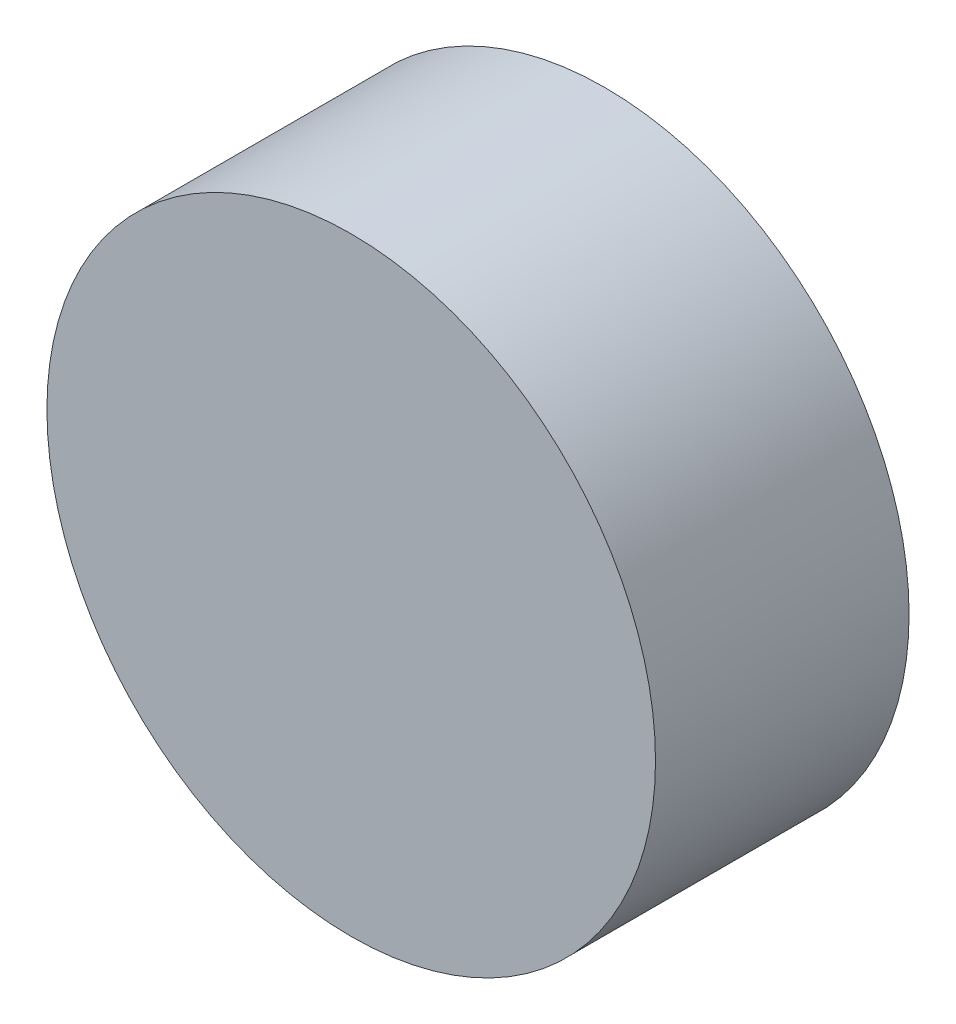
ISO-10303-21;
HEADER;
FILE_DESCRIPTION(('STEP AP214'),'2;1');
FILE_NAME('part.step','',(''),(''),'','','');
FILE_SCHEMA(('AUTOMOTIVE_DESIGN { 1 0 10303 214 1 1 1 1 }'));
ENDSEC;
DATA;
#1=APPLICATION_CONTEXT('core data for automotive mechanical design processes');
#2=APPLICATION_PROTOCOL_DEFINITION('international standard','automotive_design',2000,#1);
#3=PRODUCT_CONTEXT('',#1,'mechanical');
#4=PRODUCT('Part','Part','',(#3));
#5=PRODUCT_RELATED_PRODUCT_CATEGORY('part','',(#4));
#6=PRODUCT_DEFINITION_FORMATION('','',#4);
#7=PRODUCT_DEFINITION_CONTEXT('part definition',#1,'design');
#8=PRODUCT_DEFINITION('design','',#6,#7);
#9=PRODUCT_DEFINITION_SHAPE('','',#8);
#10=(LENGTH_UNIT() NAMED_UNIT(*) SI_UNIT(.MILLI.,.METRE.));
#11=(NAMED_UNIT(*) PLANE_ANGLE_UNIT() SI_UNIT($,.RADIAN.));
#12=(NAMED_UNIT(*) SI_UNIT($,.STERADIAN.) SOLID_ANGLE_UNIT());
#13=UNCERTAINTY_MEASURE_WITH_UNIT(LENGTH_MEASURE(1.E-05),#10,'distance_accuracy_value','');
#14=(GEOMETRIC_REPRESENTATION_CONTEXT(3) GLOBAL_UNCERTAINTY_ASSIGNED_CONTEXT((#13)) GLOBAL_UNIT_ASSIGNED_CONTEXT((#10,
#11,#12)) REPRESENTATION_CONTEXT('',''));
#15=CARTESIAN_POINT('',(0.,0.,0.));
#16=DIRECTION('',(0.,0.,1.));
#17=DIRECTION('',(1.,0.,0.));
#18=AXIS2_PLACEMENT_3D('',#15,#16,#17);
#19=CARTESIAN_POINT('',(6.30029999933331,8.2998760434166,-3.));
#20=DIRECTION('',(0.,0.,1.));
#21=DIRECTION('',(1.,0.,0.));
#22=AXIS2_PLACEMENT_3D('',#19,#20,#21);
#23=CYLINDRICAL_SURFACE('',#22,3.6);
#24=CARTESIAN_POINT('',(6.30029999933331,8.2998760434166,-3.));
#25=DIRECTION('',(0.,0.,1.));
#26=DIRECTION('',(1.,0.,0.));
#27=AXIS2_PLACEMENT_3D('',#24,#25,#26);
#28=CIRCLE('',#27,3.6);
#29=CARTESIAN_POINT('',(9.90029999933331,8.2998760434166,-3.));
#30=VERTEX_POINT('',#29);
#31=EDGE_CURVE('E10',#30,#30,#28,.T.);
#32=ORIENTED_EDGE('',*,*,#31,.T.);
#33=EDGE_LOOP('',(#32));
#34=FACE_BOUND('',#33,.T.);
#35=CARTESIAN_POINT('',(6.30029999933331,8.2998760434166,0.));
#36=DIRECTION('',(0.,0.,1.));
#37=DIRECTION('',(1.,0.,0.));
#38=AXIS2_PLACEMENT_3D('',#35,#36,#37);
#39=CIRCLE('',#38,3.6);
#40=CARTESIAN_POINT('',(9.90029999933331,8.2998760434166,0.));
#41=VERTEX_POINT('',#40);
#42=EDGE_CURVE('E34',#41,#41,#39,.T.);
#43=ORIENTED_EDGE('',*,*,#42,.F.);
#44=EDGE_LOOP('',(#43));
#45=FACE_BOUND('',#44,.T.);
#46=ADVANCED_FACE('F31',(#34,#45),#23,.T.);
#47=CARTESIAN_POINT('',(6.30029999933331,8.2998760434166,-3.));
#48=DIRECTION('',(0.,0.,1.));
#49=DIRECTION('',(1.,0.,0.));
#50=AXIS2_PLACEMENT_3D('',#47,#48,#49);
#51=PLANE('',#50);
#52=ORIENTED_EDGE('',*,*,#31,.F.);
#53=EDGE_LOOP('',(#52));
#54=FACE_BOUND('',#53,.T.);
#55=ADVANCED_FACE('F46',(#54),#51,.F.);
#56=CARTESIAN_POINT('',(6.30029999933331,8.2998760434166,0.));
#57=DIRECTION('',(0.,0.,1.));
#58=DIRECTION('',(1.,0.,0.));
#59=AXIS2_PLACEMENT_3D('',#56,#57,#58);
#60=PLANE('',#59);
#61=ORIENTED_EDGE('',*,*,#42,.T.);
#62=EDGE_LOOP('',(#61));
#63=FACE_BOUND('',#62,.T.);
#64=ADVANCED_FACE('F43',(#63),#60,.T.);
#65=CLOSED_SHELL('',(#46,#55,#64));
#66=MANIFOLD_SOLID_BREP('B2',#65);
#67=ADVANCED_BREP_SHAPE_REPRESENTATION('',(#18,#66),#14);
#68=SHAPE_DEFINITION_REPRESENTATION(#9,#67);
ENDSEC;
END-ISO-10303-21;
